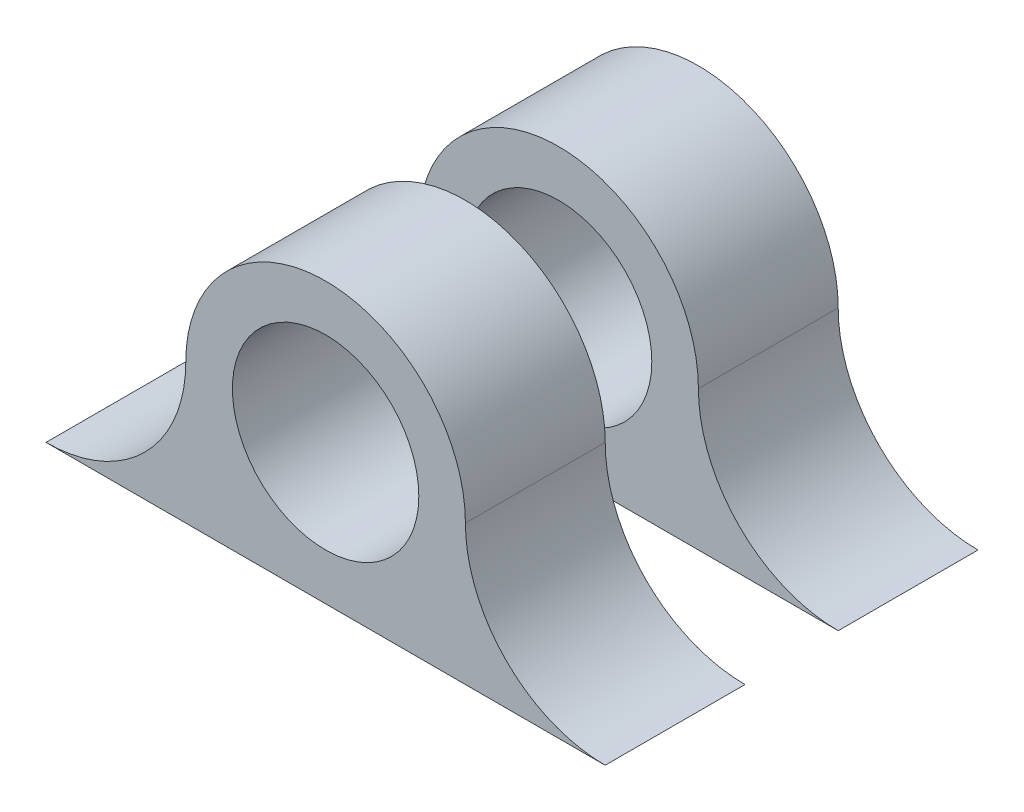
ISO-10303-21;
HEADER;
FILE_DESCRIPTION(('STEP AP214'),'2;1');
FILE_NAME('part.step','',(''),(''),'','','');
FILE_SCHEMA(('AUTOMOTIVE_DESIGN { 1 0 10303 214 1 1 1 1 }'));
ENDSEC;
DATA;
#1=APPLICATION_CONTEXT('core data for automotive mechanical design processes');
#2=APPLICATION_PROTOCOL_DEFINITION('international standard','automotive_design',2000,#1);
#3=PRODUCT_CONTEXT('',#1,'mechanical');
#4=PRODUCT('Part','Part','',(#3));
#5=PRODUCT_RELATED_PRODUCT_CATEGORY('part','',(#4));
#6=PRODUCT_DEFINITION_FORMATION('','',#4);
#7=PRODUCT_DEFINITION_CONTEXT('part definition',#1,'design');
#8=PRODUCT_DEFINITION('design','',#6,#7);
#9=PRODUCT_DEFINITION_SHAPE('','',#8);
#10=(LENGTH_UNIT() NAMED_UNIT(*) SI_UNIT(.MILLI.,.METRE.));
#11=(NAMED_UNIT(*) PLANE_ANGLE_UNIT() SI_UNIT($,.RADIAN.));
#12=(NAMED_UNIT(*) SI_UNIT($,.STERADIAN.) SOLID_ANGLE_UNIT());
#13=UNCERTAINTY_MEASURE_WITH_UNIT(LENGTH_MEASURE(1.E-05),#10,'distance_accuracy_value','');
#14=(GEOMETRIC_REPRESENTATION_CONTEXT(3) GLOBAL_UNCERTAINTY_ASSIGNED_CONTEXT((#13)) GLOBAL_UNIT_ASSIGNED_CONTEXT((#10,
#11,#12)) REPRESENTATION_CONTEXT('',''));
#15=CARTESIAN_POINT('',(0.,0.,0.));
#16=DIRECTION('',(0.,0.,1.));
#17=DIRECTION('',(1.,0.,0.));
#18=AXIS2_PLACEMENT_3D('',#15,#16,#17);
#19=CARTESIAN_POINT('',(6.5,5.75000000000001,-1.));
#20=DIRECTION('',(0.,0.,1.));
#21=DIRECTION('',(1.,0.,0.));
#22=AXIS2_PLACEMENT_3D('',#19,#20,#21);
#23=CYLINDRICAL_SURFACE('',#22,0.750000000000004);
#24=CARTESIAN_POINT('',(6.5,5.75000000000001,0.25));
#25=DIRECTION('',(0.,0.,-1.));
#26=DIRECTION('',(1.,0.,0.));
#27=AXIS2_PLACEMENT_3D('',#24,#25,#26);
#28=CIRCLE('',#27,0.750000000000004);
#29=CARTESIAN_POINT('',(6.5,5.,0.25));
#30=VERTEX_POINT('',#29);
#31=CARTESIAN_POINT('',(5.75,5.75000000000001,0.25));
#32=VERTEX_POINT('',#31);
#33=EDGE_CURVE('E81',#30,#32,#28,.T.);
#34=ORIENTED_EDGE('',*,*,#33,.T.);
#35=DIRECTION('',(0.,0.,1.));
#36=VECTOR('',#35,1.);
#37=CARTESIAN_POINT('',(5.75,5.75000000000001,-1.));
#38=LINE('',#37,#36);
#39=CARTESIAN_POINT('',(5.75,5.75000000000001,1.));
#40=VERTEX_POINT('',#39);
#41=EDGE_CURVE('E47',#32,#40,#38,.T.);
#42=ORIENTED_EDGE('',*,*,#41,.T.);
#43=CARTESIAN_POINT('',(6.5,5.75000000000001,1.));
#44=DIRECTION('',(0.,0.,-1.));
#45=DIRECTION('',(1.,0.,0.));
#46=AXIS2_PLACEMENT_3D('',#43,#44,#45);
#47=CIRCLE('',#46,0.750000000000004);
#48=CARTESIAN_POINT('',(6.5,5.,1.));
#49=VERTEX_POINT('',#48);
#50=EDGE_CURVE('E100',#49,#40,#47,.T.);
#51=ORIENTED_EDGE('',*,*,#50,.F.);
#52=DIRECTION('',(0.,0.,1.));
#53=VECTOR('',#52,1.);
#54=CARTESIAN_POINT('',(6.5,5.,-1.));
#55=LINE('',#54,#53);
#56=EDGE_CURVE('E94',#30,#49,#55,.T.);
#57=ORIENTED_EDGE('',*,*,#56,.F.);
#58=EDGE_LOOP('',(#34,#42,#51,#57));
#59=FACE_BOUND('',#58,.T.);
#60=ADVANCED_FACE('F43',(#59),#23,.F.);
#61=CARTESIAN_POINT('',(3.5,5.,-1.));
#62=DIRECTION('',(0.,-1.,0.));
#63=DIRECTION('',(0.,0.,-1.));
#64=AXIS2_PLACEMENT_3D('',#61,#62,#63);
#65=PLANE('',#64);
#66=DIRECTION('',(1.,0.,0.));
#67=VECTOR('',#66,1.);
#68=CARTESIAN_POINT('',(3.5,5.,0.25));
#69=LINE('',#68,#67);
#70=CARTESIAN_POINT('',(3.5,5.,0.25));
#71=VERTEX_POINT('',#70);
#72=EDGE_CURVE('E85',#71,#30,#69,.T.);
#73=ORIENTED_EDGE('',*,*,#72,.T.);
#74=ORIENTED_EDGE('',*,*,#56,.T.);
#75=DIRECTION('',(1.,0.,0.));
#76=VECTOR('',#75,1.);
#77=CARTESIAN_POINT('',(3.5,5.,1.));
#78=LINE('',#77,#76);
#79=CARTESIAN_POINT('',(3.5,5.,1.));
#80=VERTEX_POINT('',#79);
#81=EDGE_CURVE('E52',#80,#49,#78,.T.);
#82=ORIENTED_EDGE('',*,*,#81,.F.);
#83=DIRECTION('',(0.,0.,1.));
#84=VECTOR('',#83,1.);
#85=CARTESIAN_POINT('',(3.5,5.,-1.));
#86=LINE('',#85,#84);
#87=EDGE_CURVE('E96',#71,#80,#86,.T.);
#88=ORIENTED_EDGE('',*,*,#87,.F.);
#89=EDGE_LOOP('',(#73,#74,#82,#88));
#90=FACE_BOUND('',#89,.T.);
#91=ADVANCED_FACE('F92',(#90),#65,.T.);
#92=CARTESIAN_POINT('',(3.5,5.75000000000001,-1.));
#93=DIRECTION('',(0.,0.,1.));
#94=DIRECTION('',(1.,0.,0.));
#95=AXIS2_PLACEMENT_3D('',#92,#93,#94);
#96=CYLINDRICAL_SURFACE('',#95,0.750000000000006);
#97=CARTESIAN_POINT('',(3.5,5.75000000000001,0.25));
#98=DIRECTION('',(0.,0.,-1.));
#99=DIRECTION('',(1.,0.,0.));
#100=AXIS2_PLACEMENT_3D('',#97,#98,#99);
#101=CIRCLE('',#100,0.750000000000006);
#102=CARTESIAN_POINT('',(4.25000000000001,5.75000000000001,0.25));
#103=VERTEX_POINT('',#102);
#104=EDGE_CURVE('E66',#103,#71,#101,.T.);
#105=ORIENTED_EDGE('',*,*,#104,.T.);
#106=ORIENTED_EDGE('',*,*,#87,.T.);
#107=CARTESIAN_POINT('',(3.5,5.75000000000001,1.));
#108=DIRECTION('',(0.,0.,-1.));
#109=DIRECTION('',(1.,0.,0.));
#110=AXIS2_PLACEMENT_3D('',#107,#108,#109);
#111=CIRCLE('',#110,0.750000000000006);
#112=CARTESIAN_POINT('',(4.25000000000001,5.75000000000001,1.));
#113=VERTEX_POINT('',#112);
#114=EDGE_CURVE('E117',#113,#80,#111,.T.);
#115=ORIENTED_EDGE('',*,*,#114,.F.);
#116=DIRECTION('',(0.,0.,1.));
#117=VECTOR('',#116,1.);
#118=CARTESIAN_POINT('',(4.25000000000001,5.75000000000001,-1.));
#119=LINE('',#118,#117);
#120=EDGE_CURVE('E104',#103,#113,#119,.T.);
#121=ORIENTED_EDGE('',*,*,#120,.F.);
#122=EDGE_LOOP('',(#105,#106,#115,#121));
#123=FACE_BOUND('',#122,.T.);
#124=ADVANCED_FACE('F125',(#123),#96,.F.);
#125=CARTESIAN_POINT('',(5.,5.75000000000001,-1.));
#126=DIRECTION('',(0.,0.,1.));
#127=DIRECTION('',(1.,0.,0.));
#128=AXIS2_PLACEMENT_3D('',#125,#126,#127);
#129=CYLINDRICAL_SURFACE('',#128,0.749999999999999);
#130=CARTESIAN_POINT('',(5.,5.75000000000001,0.25));
#131=DIRECTION('',(0.,0.,1.));
#132=DIRECTION('',(1.,0.,0.));
#133=AXIS2_PLACEMENT_3D('',#130,#131,#132);
#134=CIRCLE('',#133,0.749999999999999);
#135=EDGE_CURVE('E60',#32,#103,#134,.T.);
#136=ORIENTED_EDGE('',*,*,#135,.T.);
#137=ORIENTED_EDGE('',*,*,#120,.T.);
#138=CARTESIAN_POINT('',(5.,5.75000000000001,1.));
#139=DIRECTION('',(0.,0.,1.));
#140=DIRECTION('',(1.,0.,0.));
#141=AXIS2_PLACEMENT_3D('',#138,#139,#140);
#142=CIRCLE('',#141,0.749999999999999);
#143=EDGE_CURVE('E115',#40,#113,#142,.T.);
#144=ORIENTED_EDGE('',*,*,#143,.F.);
#145=ORIENTED_EDGE('',*,*,#41,.F.);
#146=EDGE_LOOP('',(#136,#137,#144,#145));
#147=FACE_BOUND('',#146,.T.);
#148=ADVANCED_FACE('F127',(#147),#129,.T.);
#149=CARTESIAN_POINT('',(5.,5.75000000000001,-1.));
#150=DIRECTION('',(0.,0.,1.));
#151=DIRECTION('',(1.,0.,0.));
#152=AXIS2_PLACEMENT_3D('',#149,#150,#151);
#153=CYLINDRICAL_SURFACE('',#152,0.499999999999996);
#154=CARTESIAN_POINT('',(5.,5.75000000000001,0.25));
#155=DIRECTION('',(0.,0.,1.));
#156=DIRECTION('',(1.,0.,0.));
#157=AXIS2_PLACEMENT_3D('',#154,#155,#156);
#158=CIRCLE('',#157,0.499999999999996);
#159=CARTESIAN_POINT('',(5.49999999999999,5.75000000000001,0.25));
#160=VERTEX_POINT('',#159);
#161=EDGE_CURVE('E12',#160,#160,#158,.T.);
#162=ORIENTED_EDGE('',*,*,#161,.F.);
#163=EDGE_LOOP('',(#162));
#164=FACE_BOUND('',#163,.T.);
#165=CARTESIAN_POINT('',(5.,5.75000000000001,1.));
#166=DIRECTION('',(0.,0.,1.));
#167=DIRECTION('',(1.,0.,0.));
#168=AXIS2_PLACEMENT_3D('',#165,#166,#167);
#169=CIRCLE('',#168,0.499999999999996);
#170=CARTESIAN_POINT('',(5.49999999999999,5.75000000000001,1.));
#171=VERTEX_POINT('',#170);
#172=EDGE_CURVE('E105',#171,#171,#169,.T.);
#173=ORIENTED_EDGE('',*,*,#172,.T.);
#174=EDGE_LOOP('',(#173));
#175=FACE_BOUND('',#174,.T.);
#176=ADVANCED_FACE('F45',(#164,#175),#153,.F.);
#177=CARTESIAN_POINT('',(6.5,5.75000000000001,1.));
#178=DIRECTION('',(0.,0.,1.));
#179=DIRECTION('',(1.,0.,0.));
#180=AXIS2_PLACEMENT_3D('',#177,#178,#179);
#181=PLANE('',#180);
#182=ORIENTED_EDGE('',*,*,#50,.T.);
#183=ORIENTED_EDGE('',*,*,#143,.T.);
#184=ORIENTED_EDGE('',*,*,#114,.T.);
#185=ORIENTED_EDGE('',*,*,#81,.T.);
#186=EDGE_LOOP('',(#182,#183,#184,#185));
#187=FACE_BOUND('',#186,.T.);
#188=ORIENTED_EDGE('',*,*,#172,.F.);
#189=EDGE_LOOP('',(#188));
#190=FACE_BOUND('',#189,.T.);
#191=ADVANCED_FACE('F121',(#187,#190),#181,.T.);
#192=CARTESIAN_POINT('',(6.5,5.75000000000001,0.25));
#193=DIRECTION('',(0.,0.,1.));
#194=DIRECTION('',(1.,0.,0.));
#195=AXIS2_PLACEMENT_3D('',#192,#193,#194);
#196=PLANE('',#195);
#197=ORIENTED_EDGE('',*,*,#33,.F.);
#198=ORIENTED_EDGE('',*,*,#72,.F.);
#199=ORIENTED_EDGE('',*,*,#104,.F.);
#200=ORIENTED_EDGE('',*,*,#135,.F.);
#201=EDGE_LOOP('',(#197,#198,#199,#200));
#202=FACE_BOUND('',#201,.T.);
#203=ORIENTED_EDGE('',*,*,#161,.T.);
#204=EDGE_LOOP('',(#203));
#205=FACE_BOUND('',#204,.T.);
#206=ADVANCED_FACE('F83',(#202,#205),#196,.F.);
#207=CLOSED_SHELL('',(#60,#91,#124,#148,#176,#191,#206));
#208=MANIFOLD_SOLID_BREP('B2',#207);
#209=CARTESIAN_POINT('',(5.,5.75000000000001,-1.));
#210=DIRECTION('',(0.,0.,1.));
#211=DIRECTION('',(1.,0.,0.));
#212=AXIS2_PLACEMENT_3D('',#209,#210,#211);
#213=CYLINDRICAL_SURFACE('',#212,0.749999999999999);
#214=DIRECTION('',(0.,0.,1.));
#215=VECTOR('',#214,1.);
#216=CARTESIAN_POINT('',(4.25000000000001,5.75000000000001,-1.));
#217=LINE('',#216,#215);
#218=CARTESIAN_POINT('',(4.25000000000001,5.75000000000001,-1.));
#219=VERTEX_POINT('',#218);
#220=CARTESIAN_POINT('',(4.25000000000001,5.75000000000001,-0.25));
#221=VERTEX_POINT('',#220);
#222=EDGE_CURVE('E240',#219,#221,#217,.T.);
#223=ORIENTED_EDGE('',*,*,#222,.T.);
#224=CARTESIAN_POINT('',(5.,5.75000000000001,-0.25));
#225=DIRECTION('',(0.,0.,1.));
#226=DIRECTION('',(1.,0.,0.));
#227=AXIS2_PLACEMENT_3D('',#224,#225,#226);
#228=CIRCLE('',#227,0.749999999999999);
#229=CARTESIAN_POINT('',(5.75,5.75000000000001,-0.25));
#230=VERTEX_POINT('',#229);
#231=EDGE_CURVE('E227',#230,#221,#228,.T.);
#232=ORIENTED_EDGE('',*,*,#231,.F.);
#233=DIRECTION('',(0.,0.,1.));
#234=VECTOR('',#233,1.);
#235=CARTESIAN_POINT('',(5.75,5.75000000000001,-1.));
#236=LINE('',#235,#234);
#237=CARTESIAN_POINT('',(5.75,5.75000000000001,-1.));
#238=VERTEX_POINT('',#237);
#239=EDGE_CURVE('E192',#238,#230,#236,.T.);
#240=ORIENTED_EDGE('',*,*,#239,.F.);
#241=CARTESIAN_POINT('',(5.,5.75000000000001,-1.));
#242=DIRECTION('',(0.,0.,1.));
#243=DIRECTION('',(1.,0.,0.));
#244=AXIS2_PLACEMENT_3D('',#241,#242,#243);
#245=CIRCLE('',#244,0.749999999999999);
#246=EDGE_CURVE('E246',#238,#219,#245,.T.);
#247=ORIENTED_EDGE('',*,*,#246,.T.);
#248=EDGE_LOOP('',(#223,#232,#240,#247));
#249=FACE_BOUND('',#248,.T.);
#250=ADVANCED_FACE('F188',(#249),#213,.T.);
#251=CARTESIAN_POINT('',(3.5,5.75000000000001,-1.));
#252=DIRECTION('',(0.,0.,1.));
#253=DIRECTION('',(1.,0.,0.));
#254=AXIS2_PLACEMENT_3D('',#251,#252,#253);
#255=CYLINDRICAL_SURFACE('',#254,0.750000000000006);
#256=DIRECTION('',(0.,0.,1.));
#257=VECTOR('',#256,1.);
#258=CARTESIAN_POINT('',(3.5,5.,-1.));
#259=LINE('',#258,#257);
#260=CARTESIAN_POINT('',(3.5,5.,-1.));
#261=VERTEX_POINT('',#260);
#262=CARTESIAN_POINT('',(3.5,5.,-0.25));
#263=VERTEX_POINT('',#262);
#264=EDGE_CURVE('E197',#261,#263,#259,.T.);
#265=ORIENTED_EDGE('',*,*,#264,.T.);
#266=CARTESIAN_POINT('',(3.5,5.75000000000001,-0.25));
#267=DIRECTION('',(0.,0.,-1.));
#268=DIRECTION('',(1.,0.,0.));
#269=AXIS2_PLACEMENT_3D('',#266,#267,#268);
#270=CIRCLE('',#269,0.750000000000006);
#271=EDGE_CURVE('E230',#221,#263,#270,.T.);
#272=ORIENTED_EDGE('',*,*,#271,.F.);
#273=ORIENTED_EDGE('',*,*,#222,.F.);
#274=CARTESIAN_POINT('',(3.5,5.75000000000001,-1.));
#275=DIRECTION('',(0.,0.,-1.));
#276=DIRECTION('',(1.,0.,0.));
#277=AXIS2_PLACEMENT_3D('',#274,#275,#276);
#278=CIRCLE('',#277,0.750000000000006);
#279=EDGE_CURVE('E252',#219,#261,#278,.T.);
#280=ORIENTED_EDGE('',*,*,#279,.T.);
#281=EDGE_LOOP('',(#265,#272,#273,#280));
#282=FACE_BOUND('',#281,.T.);
#283=ADVANCED_FACE('F238',(#282),#255,.F.);
#284=CARTESIAN_POINT('',(3.5,5.,-1.));
#285=DIRECTION('',(0.,-1.,0.));
#286=DIRECTION('',(0.,0.,-1.));
#287=AXIS2_PLACEMENT_3D('',#284,#285,#286);
#288=PLANE('',#287);
#289=DIRECTION('',(0.,0.,1.));
#290=VECTOR('',#289,1.);
#291=CARTESIAN_POINT('',(6.5,5.,-1.));
#292=LINE('',#291,#290);
#293=CARTESIAN_POINT('',(6.5,5.,-1.));
#294=VERTEX_POINT('',#293);
#295=CARTESIAN_POINT('',(6.5,5.,-0.25));
#296=VERTEX_POINT('',#295);
#297=EDGE_CURVE('E41',#294,#296,#292,.T.);
#298=ORIENTED_EDGE('',*,*,#297,.T.);
#299=DIRECTION('',(1.,0.,0.));
#300=VECTOR('',#299,1.);
#301=CARTESIAN_POINT('',(3.5,5.,-0.25));
#302=LINE('',#301,#300);
#303=EDGE_CURVE('E242',#263,#296,#302,.T.);
#304=ORIENTED_EDGE('',*,*,#303,.F.);
#305=ORIENTED_EDGE('',*,*,#264,.F.);
#306=DIRECTION('',(1.,0.,0.));
#307=VECTOR('',#306,1.);
#308=CARTESIAN_POINT('',(3.5,5.,-1.));
#309=LINE('',#308,#307);
#310=EDGE_CURVE('E248',#261,#294,#309,.T.);
#311=ORIENTED_EDGE('',*,*,#310,.T.);
#312=EDGE_LOOP('',(#298,#304,#305,#311));
#313=FACE_BOUND('',#312,.T.);
#314=ADVANCED_FACE('F280',(#313),#288,.T.);
#315=CARTESIAN_POINT('',(6.5,5.75000000000001,-1.));
#316=DIRECTION('',(0.,0.,1.));
#317=DIRECTION('',(1.,0.,0.));
#318=AXIS2_PLACEMENT_3D('',#315,#316,#317);
#319=CYLINDRICAL_SURFACE('',#318,0.750000000000004);
#320=ORIENTED_EDGE('',*,*,#239,.T.);
#321=CARTESIAN_POINT('',(6.5,5.75000000000001,-0.25));
#322=DIRECTION('',(0.,0.,-1.));
#323=DIRECTION('',(1.,0.,0.));
#324=AXIS2_PLACEMENT_3D('',#321,#322,#323);
#325=CIRCLE('',#324,0.750000000000004);
#326=EDGE_CURVE('E205',#296,#230,#325,.T.);
#327=ORIENTED_EDGE('',*,*,#326,.F.);
#328=ORIENTED_EDGE('',*,*,#297,.F.);
#329=CARTESIAN_POINT('',(6.5,5.75000000000001,-1.));
#330=DIRECTION('',(0.,0.,-1.));
#331=DIRECTION('',(1.,0.,0.));
#332=AXIS2_PLACEMENT_3D('',#329,#330,#331);
#333=CIRCLE('',#332,0.750000000000004);
#334=EDGE_CURVE('E255',#294,#238,#333,.T.);
#335=ORIENTED_EDGE('',*,*,#334,.T.);
#336=EDGE_LOOP('',(#320,#327,#328,#335));
#337=FACE_BOUND('',#336,.T.);
#338=ADVANCED_FACE('F190',(#337),#319,.F.);
#339=CARTESIAN_POINT('',(6.5,5.75000000000001,-1.));
#340=DIRECTION('',(0.,0.,1.));
#341=DIRECTION('',(1.,0.,0.));
#342=AXIS2_PLACEMENT_3D('',#339,#340,#341);
#343=PLANE('',#342);
#344=CARTESIAN_POINT('',(5.,5.75000000000001,-1.));
#345=DIRECTION('',(0.,0.,1.));
#346=DIRECTION('',(1.,0.,0.));
#347=AXIS2_PLACEMENT_3D('',#344,#345,#346);
#348=CIRCLE('',#347,0.499999999999996);
#349=CARTESIAN_POINT('',(5.49999999999999,5.75000000000001,-1.));
#350=VERTEX_POINT('',#349);
#351=EDGE_CURVE('E257',#350,#350,#348,.T.);
#352=ORIENTED_EDGE('',*,*,#351,.T.);
#353=EDGE_LOOP('',(#352));
#354=FACE_BOUND('',#353,.T.);
#355=ORIENTED_EDGE('',*,*,#334,.F.);
#356=ORIENTED_EDGE('',*,*,#310,.F.);
#357=ORIENTED_EDGE('',*,*,#279,.F.);
#358=ORIENTED_EDGE('',*,*,#246,.F.);
#359=EDGE_LOOP('',(#355,#356,#357,#358));
#360=FACE_BOUND('',#359,.T.);
#361=ADVANCED_FACE('F273',(#354,#360),#343,.F.);
#362=CARTESIAN_POINT('',(5.,5.75000000000001,-1.));
#363=DIRECTION('',(0.,0.,1.));
#364=DIRECTION('',(1.,0.,0.));
#365=AXIS2_PLACEMENT_3D('',#362,#363,#364);
#366=CYLINDRICAL_SURFACE('',#365,0.499999999999996);
#367=ORIENTED_EDGE('',*,*,#351,.F.);
#368=EDGE_LOOP('',(#367));
#369=FACE_BOUND('',#368,.T.);
#370=CARTESIAN_POINT('',(5.,5.75000000000001,-0.25));
#371=DIRECTION('',(0.,0.,1.));
#372=DIRECTION('',(1.,0.,0.));
#373=AXIS2_PLACEMENT_3D('',#370,#371,#372);
#374=CIRCLE('',#373,0.499999999999996);
#375=CARTESIAN_POINT('',(5.49999999999999,5.75000000000001,-0.25));
#376=VERTEX_POINT('',#375);
#377=EDGE_CURVE('E262',#376,#376,#374,.T.);
#378=ORIENTED_EDGE('',*,*,#377,.T.);
#379=EDGE_LOOP('',(#378));
#380=FACE_BOUND('',#379,.T.);
#381=ADVANCED_FACE('F266',(#369,#380),#366,.F.);
#382=CARTESIAN_POINT('',(6.5,5.75000000000001,-0.25));
#383=DIRECTION('',(0.,0.,1.));
#384=DIRECTION('',(1.,0.,0.));
#385=AXIS2_PLACEMENT_3D('',#382,#383,#384);
#386=PLANE('',#385);
#387=ORIENTED_EDGE('',*,*,#377,.F.);
#388=EDGE_LOOP('',(#387));
#389=FACE_BOUND('',#388,.T.);
#390=ORIENTED_EDGE('',*,*,#326,.T.);
#391=ORIENTED_EDGE('',*,*,#231,.T.);
#392=ORIENTED_EDGE('',*,*,#271,.T.);
#393=ORIENTED_EDGE('',*,*,#303,.T.);
#394=EDGE_LOOP('',(#390,#391,#392,#393));
#395=FACE_BOUND('',#394,.T.);
#396=ADVANCED_FACE('F229',(#389,#395),#386,.T.);
#397=CLOSED_SHELL('',(#250,#283,#314,#338,#361,#381,#396));
#398=MANIFOLD_SOLID_BREP('B6',#397);
#399=ADVANCED_BREP_SHAPE_REPRESENTATION('',(#18,#208,#398),#14);
#400=SHAPE_DEFINITION_REPRESENTATION(#9,#399);
ENDSEC;
END-ISO-10303-21;
